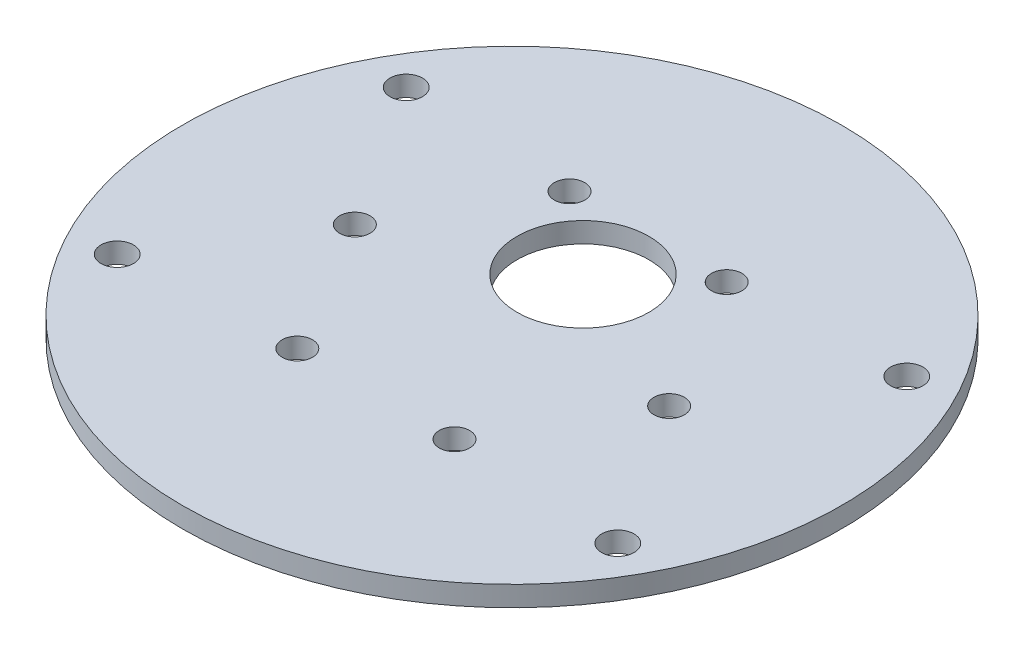
ISO-10303-21;
HEADER;
FILE_DESCRIPTION(('STEP AP214'),'2;1');
FILE_NAME('part.step','',(''),(''),'','','');
FILE_SCHEMA(('AUTOMOTIVE_DESIGN { 1 0 10303 214 1 1 1 1 }'));
ENDSEC;
DATA;
#1=APPLICATION_CONTEXT('core data for automotive mechanical design processes');
#2=APPLICATION_PROTOCOL_DEFINITION('international standard','automotive_design',2000,#1);
#3=PRODUCT_CONTEXT('',#1,'mechanical');
#4=PRODUCT('Part','Part','',(#3));
#5=PRODUCT_RELATED_PRODUCT_CATEGORY('part','',(#4));
#6=PRODUCT_DEFINITION_FORMATION('','',#4);
#7=PRODUCT_DEFINITION_CONTEXT('part definition',#1,'design');
#8=PRODUCT_DEFINITION('design','',#6,#7);
#9=PRODUCT_DEFINITION_SHAPE('','',#8);
#10=(LENGTH_UNIT() NAMED_UNIT(*) SI_UNIT(.MILLI.,.METRE.));
#11=(NAMED_UNIT(*) PLANE_ANGLE_UNIT() SI_UNIT($,.RADIAN.));
#12=(NAMED_UNIT(*) SI_UNIT($,.STERADIAN.) SOLID_ANGLE_UNIT());
#13=UNCERTAINTY_MEASURE_WITH_UNIT(LENGTH_MEASURE(1.E-05),#10,'distance_accuracy_value','');
#14=(GEOMETRIC_REPRESENTATION_CONTEXT(3) GLOBAL_UNCERTAINTY_ASSIGNED_CONTEXT((#13)) GLOBAL_UNIT_ASSIGNED_CONTEXT((#10,
#11,#12)) REPRESENTATION_CONTEXT('',''));
#15=CARTESIAN_POINT('',(0.,0.,0.));
#16=DIRECTION('',(0.,0.,1.));
#17=DIRECTION('',(1.,0.,0.));
#18=AXIS2_PLACEMENT_3D('',#15,#16,#17);
#19=CARTESIAN_POINT('',(0.,2.,0.));
#20=DIRECTION('',(0.,1.,0.));
#21=DIRECTION('',(0.,0.,1.));
#22=AXIS2_PLACEMENT_3D('',#19,#20,#21);
#23=PLANE('',#22);
#24=CARTESIAN_POINT('',(-7.75000000000001,2.,-13.4233937586588));
#25=DIRECTION('',(0.,1.,0.));
#26=DIRECTION('',(0.,0.,1.));
#27=AXIS2_PLACEMENT_3D('',#24,#25,#26);
#28=CIRCLE('',#27,1.5);
#29=CARTESIAN_POINT('',(-7.75000000000001,2.,-11.9233937586588));
#30=VERTEX_POINT('',#29);
#31=EDGE_CURVE('E99',#30,#30,#28,.T.);
#32=ORIENTED_EDGE('',*,*,#31,.F.);
#33=EDGE_LOOP('',(#32));
#34=FACE_BOUND('',#33,.T.);
#35=CARTESIAN_POINT('',(24.6817240078565,2.,-14.25));
#36=DIRECTION('',(0.,1.,0.));
#37=DIRECTION('',(0.,0.,-1.));
#38=AXIS2_PLACEMENT_3D('',#35,#36,#37);
#39=CIRCLE('',#38,1.6);
#40=CARTESIAN_POINT('',(24.6817240078565,2.,-15.85));
#41=VERTEX_POINT('',#40);
#42=EDGE_CURVE('E87',#41,#41,#39,.T.);
#43=ORIENTED_EDGE('',*,*,#42,.F.);
#44=EDGE_LOOP('',(#43));
#45=FACE_BOUND('',#44,.T.);
#46=CARTESIAN_POINT('',(-15.5,2.,0.));
#47=DIRECTION('',(0.,1.,0.));
#48=DIRECTION('',(0.,0.,1.));
#49=AXIS2_PLACEMENT_3D('',#46,#47,#48);
#50=CIRCLE('',#49,1.5);
#51=CARTESIAN_POINT('',(-15.5,2.,1.50000000000001));
#52=VERTEX_POINT('',#51);
#53=EDGE_CURVE('E75',#52,#52,#50,.T.);
#54=ORIENTED_EDGE('',*,*,#53,.F.);
#55=EDGE_LOOP('',(#54));
#56=FACE_BOUND('',#55,.T.);
#57=CARTESIAN_POINT('',(-7.75,2.,13.4233937586588));
#58=DIRECTION('',(0.,1.,0.));
#59=DIRECTION('',(0.,0.,1.));
#60=AXIS2_PLACEMENT_3D('',#57,#58,#59);
#61=CIRCLE('',#60,1.5);
#62=CARTESIAN_POINT('',(-7.75,2.,14.9233937586588));
#63=VERTEX_POINT('',#62);
#64=EDGE_CURVE('E63',#63,#63,#61,.T.);
#65=ORIENTED_EDGE('',*,*,#64,.F.);
#66=EDGE_LOOP('',(#65));
#67=FACE_BOUND('',#66,.T.);
#68=CARTESIAN_POINT('',(15.5,2.,0.));
#69=DIRECTION('',(0.,1.,0.));
#70=DIRECTION('',(0.,0.,1.));
#71=AXIS2_PLACEMENT_3D('',#68,#69,#70);
#72=CIRCLE('',#71,1.5);
#73=CARTESIAN_POINT('',(15.5,2.,1.5));
#74=VERTEX_POINT('',#73);
#75=EDGE_CURVE('E51',#74,#74,#72,.T.);
#76=ORIENTED_EDGE('',*,*,#75,.F.);
#77=EDGE_LOOP('',(#76));
#78=FACE_BOUND('',#77,.T.);
#79=CARTESIAN_POINT('',(0.,2.,0.));
#80=DIRECTION('',(0.,1.,0.));
#81=DIRECTION('',(0.,0.,1.));
#82=AXIS2_PLACEMENT_3D('',#79,#80,#81);
#83=CIRCLE('',#82,32.5);
#84=CARTESIAN_POINT('',(0.,2.,32.5));
#85=VERTEX_POINT('',#84);
#86=EDGE_CURVE('E10',#85,#85,#83,.T.);
#87=ORIENTED_EDGE('',*,*,#86,.T.);
#88=EDGE_LOOP('',(#87));
#89=FACE_BOUND('',#88,.T.);
#90=CARTESIAN_POINT('',(0.,2.,-7.));
#91=DIRECTION('',(0.,1.,0.));
#92=DIRECTION('',(0.,0.,1.));
#93=AXIS2_PLACEMENT_3D('',#90,#91,#92);
#94=CIRCLE('',#93,6.5);
#95=CARTESIAN_POINT('',(0.,2.,-0.499999999999999));
#96=VERTEX_POINT('',#95);
#97=EDGE_CURVE('E46',#96,#96,#94,.T.);
#98=ORIENTED_EDGE('',*,*,#97,.F.);
#99=EDGE_LOOP('',(#98));
#100=FACE_BOUND('',#99,.T.);
#101=CARTESIAN_POINT('',(7.75,2.,13.4233937586588));
#102=DIRECTION('',(0.,1.,0.));
#103=DIRECTION('',(0.,0.,1.));
#104=AXIS2_PLACEMENT_3D('',#101,#102,#103);
#105=CIRCLE('',#104,1.5);
#106=CARTESIAN_POINT('',(7.75,2.,14.9233937586588));
#107=VERTEX_POINT('',#106);
#108=EDGE_CURVE('E57',#107,#107,#105,.T.);
#109=ORIENTED_EDGE('',*,*,#108,.F.);
#110=EDGE_LOOP('',(#109));
#111=FACE_BOUND('',#110,.T.);
#112=CARTESIAN_POINT('',(24.6817240078565,2.,14.25));
#113=DIRECTION('',(0.,1.,0.));
#114=DIRECTION('',(0.,0.,1.));
#115=AXIS2_PLACEMENT_3D('',#112,#113,#114);
#116=CIRCLE('',#115,1.6);
#117=CARTESIAN_POINT('',(24.6817240078565,2.,15.85));
#118=VERTEX_POINT('',#117);
#119=EDGE_CURVE('E69',#118,#118,#116,.T.);
#120=ORIENTED_EDGE('',*,*,#119,.F.);
#121=EDGE_LOOP('',(#120));
#122=FACE_BOUND('',#121,.T.);
#123=CARTESIAN_POINT('',(-24.6817240078565,2.,14.25));
#124=DIRECTION('',(0.,1.,0.));
#125=DIRECTION('',(0.,0.,-1.));
#126=AXIS2_PLACEMENT_3D('',#123,#124,#125);
#127=CIRCLE('',#126,1.6);
#128=CARTESIAN_POINT('',(-24.6817240078565,2.,12.65));
#129=VERTEX_POINT('',#128);
#130=EDGE_CURVE('E81',#129,#129,#127,.T.);
#131=ORIENTED_EDGE('',*,*,#130,.F.);
#132=EDGE_LOOP('',(#131));
#133=FACE_BOUND('',#132,.T.);
#134=CARTESIAN_POINT('',(-24.6817240078565,2.,-14.25));
#135=DIRECTION('',(0.,1.,0.));
#136=DIRECTION('',(0.,0.,1.));
#137=AXIS2_PLACEMENT_3D('',#134,#135,#136);
#138=CIRCLE('',#137,1.6);
#139=CARTESIAN_POINT('',(-24.6817240078565,2.,-12.65));
#140=VERTEX_POINT('',#139);
#141=EDGE_CURVE('E93',#140,#140,#138,.T.);
#142=ORIENTED_EDGE('',*,*,#141,.F.);
#143=EDGE_LOOP('',(#142));
#144=FACE_BOUND('',#143,.T.);
#145=CARTESIAN_POINT('',(7.75,2.,-13.4233937586588));
#146=DIRECTION('',(0.,1.,0.));
#147=DIRECTION('',(0.,0.,1.));
#148=AXIS2_PLACEMENT_3D('',#145,#146,#147);
#149=CIRCLE('',#148,1.5);
#150=CARTESIAN_POINT('',(7.75,2.,-11.9233937586588));
#151=VERTEX_POINT('',#150);
#152=EDGE_CURVE('E105',#151,#151,#149,.T.);
#153=ORIENTED_EDGE('',*,*,#152,.F.);
#154=EDGE_LOOP('',(#153));
#155=FACE_BOUND('',#154,.T.);
#156=ADVANCED_FACE('F35',(#34,#45,#56,#67,#78,#89,#100,#111,#122,#133,#144,#155),#23,.T.);
#157=CARTESIAN_POINT('',(0.,0.,0.));
#158=DIRECTION('',(0.,1.,0.));
#159=DIRECTION('',(0.,0.,1.));
#160=AXIS2_PLACEMENT_3D('',#157,#158,#159);
#161=PLANE('',#160);
#162=CARTESIAN_POINT('',(0.,0.,0.));
#163=DIRECTION('',(0.,1.,0.));
#164=DIRECTION('',(0.,0.,1.));
#165=AXIS2_PLACEMENT_3D('',#162,#163,#164);
#166=CIRCLE('',#165,32.5);
#167=CARTESIAN_POINT('',(0.,0.,32.5));
#168=VERTEX_POINT('',#167);
#169=EDGE_CURVE('E39',#168,#168,#166,.T.);
#170=ORIENTED_EDGE('',*,*,#169,.F.);
#171=EDGE_LOOP('',(#170));
#172=FACE_BOUND('',#171,.T.);
#173=CARTESIAN_POINT('',(0.,0.,-7.));
#174=DIRECTION('',(0.,1.,0.));
#175=DIRECTION('',(0.,0.,1.));
#176=AXIS2_PLACEMENT_3D('',#173,#174,#175);
#177=CIRCLE('',#176,6.5);
#178=CARTESIAN_POINT('',(0.,0.,-0.499999999999999));
#179=VERTEX_POINT('',#178);
#180=EDGE_CURVE('E48',#179,#179,#177,.T.);
#181=ORIENTED_EDGE('',*,*,#180,.T.);
#182=EDGE_LOOP('',(#181));
#183=FACE_BOUND('',#182,.T.);
#184=CARTESIAN_POINT('',(15.5,0.,0.));
#185=DIRECTION('',(0.,1.,0.));
#186=DIRECTION('',(0.,0.,1.));
#187=AXIS2_PLACEMENT_3D('',#184,#185,#186);
#188=CIRCLE('',#187,1.5);
#189=CARTESIAN_POINT('',(15.5,0.,1.5));
#190=VERTEX_POINT('',#189);
#191=EDGE_CURVE('E54',#190,#190,#188,.T.);
#192=ORIENTED_EDGE('',*,*,#191,.T.);
#193=EDGE_LOOP('',(#192));
#194=FACE_BOUND('',#193,.T.);
#195=CARTESIAN_POINT('',(7.75,0.,13.4233937586588));
#196=DIRECTION('',(0.,1.,0.));
#197=DIRECTION('',(0.,0.,1.));
#198=AXIS2_PLACEMENT_3D('',#195,#196,#197);
#199=CIRCLE('',#198,1.5);
#200=CARTESIAN_POINT('',(7.75,0.,14.9233937586588));
#201=VERTEX_POINT('',#200);
#202=EDGE_CURVE('E60',#201,#201,#199,.T.);
#203=ORIENTED_EDGE('',*,*,#202,.T.);
#204=EDGE_LOOP('',(#203));
#205=FACE_BOUND('',#204,.T.);
#206=CARTESIAN_POINT('',(-7.75,0.,13.4233937586588));
#207=DIRECTION('',(0.,1.,0.));
#208=DIRECTION('',(0.,0.,1.));
#209=AXIS2_PLACEMENT_3D('',#206,#207,#208);
#210=CIRCLE('',#209,1.5);
#211=CARTESIAN_POINT('',(-7.75,0.,14.9233937586588));
#212=VERTEX_POINT('',#211);
#213=EDGE_CURVE('E66',#212,#212,#210,.T.);
#214=ORIENTED_EDGE('',*,*,#213,.T.);
#215=EDGE_LOOP('',(#214));
#216=FACE_BOUND('',#215,.T.);
#217=CARTESIAN_POINT('',(24.6817240078565,0.,14.25));
#218=DIRECTION('',(0.,1.,0.));
#219=DIRECTION('',(0.,0.,1.));
#220=AXIS2_PLACEMENT_3D('',#217,#218,#219);
#221=CIRCLE('',#220,1.6);
#222=CARTESIAN_POINT('',(24.6817240078565,0.,15.85));
#223=VERTEX_POINT('',#222);
#224=EDGE_CURVE('E72',#223,#223,#221,.T.);
#225=ORIENTED_EDGE('',*,*,#224,.T.);
#226=EDGE_LOOP('',(#225));
#227=FACE_BOUND('',#226,.T.);
#228=CARTESIAN_POINT('',(-15.5,0.,0.));
#229=DIRECTION('',(0.,1.,0.));
#230=DIRECTION('',(0.,0.,1.));
#231=AXIS2_PLACEMENT_3D('',#228,#229,#230);
#232=CIRCLE('',#231,1.5);
#233=CARTESIAN_POINT('',(-15.5,0.,1.50000000000001));
#234=VERTEX_POINT('',#233);
#235=EDGE_CURVE('E78',#234,#234,#232,.T.);
#236=ORIENTED_EDGE('',*,*,#235,.T.);
#237=EDGE_LOOP('',(#236));
#238=FACE_BOUND('',#237,.T.);
#239=CARTESIAN_POINT('',(-24.6817240078565,0.,14.25));
#240=DIRECTION('',(0.,1.,0.));
#241=DIRECTION('',(0.,0.,-1.));
#242=AXIS2_PLACEMENT_3D('',#239,#240,#241);
#243=CIRCLE('',#242,1.6);
#244=CARTESIAN_POINT('',(-24.6817240078565,0.,12.65));
#245=VERTEX_POINT('',#244);
#246=EDGE_CURVE('E84',#245,#245,#243,.T.);
#247=ORIENTED_EDGE('',*,*,#246,.T.);
#248=EDGE_LOOP('',(#247));
#249=FACE_BOUND('',#248,.T.);
#250=CARTESIAN_POINT('',(24.6817240078565,0.,-14.25));
#251=DIRECTION('',(0.,1.,0.));
#252=DIRECTION('',(0.,0.,-1.));
#253=AXIS2_PLACEMENT_3D('',#250,#251,#252);
#254=CIRCLE('',#253,1.6);
#255=CARTESIAN_POINT('',(24.6817240078565,0.,-15.85));
#256=VERTEX_POINT('',#255);
#257=EDGE_CURVE('E90',#256,#256,#254,.T.);
#258=ORIENTED_EDGE('',*,*,#257,.T.);
#259=EDGE_LOOP('',(#258));
#260=FACE_BOUND('',#259,.T.);
#261=CARTESIAN_POINT('',(-24.6817240078565,0.,-14.25));
#262=DIRECTION('',(0.,1.,0.));
#263=DIRECTION('',(0.,0.,1.));
#264=AXIS2_PLACEMENT_3D('',#261,#262,#263);
#265=CIRCLE('',#264,1.6);
#266=CARTESIAN_POINT('',(-24.6817240078565,0.,-12.65));
#267=VERTEX_POINT('',#266);
#268=EDGE_CURVE('E96',#267,#267,#265,.T.);
#269=ORIENTED_EDGE('',*,*,#268,.T.);
#270=EDGE_LOOP('',(#269));
#271=FACE_BOUND('',#270,.T.);
#272=CARTESIAN_POINT('',(-7.75000000000001,0.,-13.4233937586588));
#273=DIRECTION('',(0.,1.,0.));
#274=DIRECTION('',(0.,0.,1.));
#275=AXIS2_PLACEMENT_3D('',#272,#273,#274);
#276=CIRCLE('',#275,1.5);
#277=CARTESIAN_POINT('',(-7.75000000000001,0.,-11.9233937586588));
#278=VERTEX_POINT('',#277);
#279=EDGE_CURVE('E102',#278,#278,#276,.T.);
#280=ORIENTED_EDGE('',*,*,#279,.T.);
#281=EDGE_LOOP('',(#280));
#282=FACE_BOUND('',#281,.T.);
#283=CARTESIAN_POINT('',(7.75,0.,-13.4233937586588));
#284=DIRECTION('',(0.,1.,0.));
#285=DIRECTION('',(0.,0.,1.));
#286=AXIS2_PLACEMENT_3D('',#283,#284,#285);
#287=CIRCLE('',#286,1.5);
#288=CARTESIAN_POINT('',(7.75,0.,-11.9233937586588));
#289=VERTEX_POINT('',#288);
#290=EDGE_CURVE('E108',#289,#289,#287,.T.);
#291=ORIENTED_EDGE('',*,*,#290,.T.);
#292=EDGE_LOOP('',(#291));
#293=FACE_BOUND('',#292,.T.);
#294=ADVANCED_FACE('F118',(#172,#183,#194,#205,#216,#227,#238,#249,#260,#271,#282,#293),#161,.F.);
#295=CARTESIAN_POINT('',(0.,2.,0.));
#296=DIRECTION('',(0.,-1.,0.));
#297=DIRECTION('',(0.,0.,-1.));
#298=AXIS2_PLACEMENT_3D('',#295,#296,#297);
#299=CYLINDRICAL_SURFACE('',#298,32.5);
#300=ORIENTED_EDGE('',*,*,#86,.F.);
#301=EDGE_LOOP('',(#300));
#302=FACE_BOUND('',#301,.T.);
#303=ORIENTED_EDGE('',*,*,#169,.T.);
#304=EDGE_LOOP('',(#303));
#305=FACE_BOUND('',#304,.T.);
#306=ADVANCED_FACE('F37',(#302,#305),#299,.T.);
#307=CARTESIAN_POINT('',(0.,2.,-7.));
#308=DIRECTION('',(0.,-1.,0.));
#309=DIRECTION('',(0.,0.,-1.));
#310=AXIS2_PLACEMENT_3D('',#307,#308,#309);
#311=CYLINDRICAL_SURFACE('',#310,6.5);
#312=ORIENTED_EDGE('',*,*,#97,.T.);
#313=EDGE_LOOP('',(#312));
#314=FACE_BOUND('',#313,.T.);
#315=ORIENTED_EDGE('',*,*,#180,.F.);
#316=EDGE_LOOP('',(#315));
#317=FACE_BOUND('',#316,.T.);
#318=ADVANCED_FACE('F128',(#314,#317),#311,.F.);
#319=CARTESIAN_POINT('',(15.5,2.,0.));
#320=DIRECTION('',(0.,-1.,0.));
#321=DIRECTION('',(0.,0.,-1.));
#322=AXIS2_PLACEMENT_3D('',#319,#320,#321);
#323=CYLINDRICAL_SURFACE('',#322,1.5);
#324=ORIENTED_EDGE('',*,*,#75,.T.);
#325=EDGE_LOOP('',(#324));
#326=FACE_BOUND('',#325,.T.);
#327=ORIENTED_EDGE('',*,*,#191,.F.);
#328=EDGE_LOOP('',(#327));
#329=FACE_BOUND('',#328,.T.);
#330=ADVANCED_FACE('F131',(#326,#329),#323,.F.);
#331=CARTESIAN_POINT('',(7.75,2.,13.4233937586588));
#332=DIRECTION('',(0.,-1.,0.));
#333=DIRECTION('',(0.,0.,-1.));
#334=AXIS2_PLACEMENT_3D('',#331,#332,#333);
#335=CYLINDRICAL_SURFACE('',#334,1.5);
#336=ORIENTED_EDGE('',*,*,#108,.T.);
#337=EDGE_LOOP('',(#336));
#338=FACE_BOUND('',#337,.T.);
#339=ORIENTED_EDGE('',*,*,#202,.F.);
#340=EDGE_LOOP('',(#339));
#341=FACE_BOUND('',#340,.T.);
#342=ADVANCED_FACE('F135',(#338,#341),#335,.F.);
#343=CARTESIAN_POINT('',(-7.75,2.,13.4233937586588));
#344=DIRECTION('',(0.,-1.,0.));
#345=DIRECTION('',(0.,0.,-1.));
#346=AXIS2_PLACEMENT_3D('',#343,#344,#345);
#347=CYLINDRICAL_SURFACE('',#346,1.5);
#348=ORIENTED_EDGE('',*,*,#64,.T.);
#349=EDGE_LOOP('',(#348));
#350=FACE_BOUND('',#349,.T.);
#351=ORIENTED_EDGE('',*,*,#213,.F.);
#352=EDGE_LOOP('',(#351));
#353=FACE_BOUND('',#352,.T.);
#354=ADVANCED_FACE('F139',(#350,#353),#347,.F.);
#355=CARTESIAN_POINT('',(24.6817240078565,2.,14.25));
#356=DIRECTION('',(0.,-1.,0.));
#357=DIRECTION('',(0.,0.,-1.));
#358=AXIS2_PLACEMENT_3D('',#355,#356,#357);
#359=CYLINDRICAL_SURFACE('',#358,1.6);
#360=ORIENTED_EDGE('',*,*,#119,.T.);
#361=EDGE_LOOP('',(#360));
#362=FACE_BOUND('',#361,.T.);
#363=ORIENTED_EDGE('',*,*,#224,.F.);
#364=EDGE_LOOP('',(#363));
#365=FACE_BOUND('',#364,.T.);
#366=ADVANCED_FACE('F143',(#362,#365),#359,.F.);
#367=CARTESIAN_POINT('',(-15.5,2.,0.));
#368=DIRECTION('',(0.,-1.,0.));
#369=DIRECTION('',(0.,0.,-1.));
#370=AXIS2_PLACEMENT_3D('',#367,#368,#369);
#371=CYLINDRICAL_SURFACE('',#370,1.5);
#372=ORIENTED_EDGE('',*,*,#53,.T.);
#373=EDGE_LOOP('',(#372));
#374=FACE_BOUND('',#373,.T.);
#375=ORIENTED_EDGE('',*,*,#235,.F.);
#376=EDGE_LOOP('',(#375));
#377=FACE_BOUND('',#376,.T.);
#378=ADVANCED_FACE('F147',(#374,#377),#371,.F.);
#379=CARTESIAN_POINT('',(-24.6817240078565,2.,14.25));
#380=DIRECTION('',(0.,-1.,0.));
#381=DIRECTION('',(0.,0.,-1.));
#382=AXIS2_PLACEMENT_3D('',#379,#380,#381);
#383=CYLINDRICAL_SURFACE('',#382,1.6);
#384=ORIENTED_EDGE('',*,*,#130,.T.);
#385=EDGE_LOOP('',(#384));
#386=FACE_BOUND('',#385,.T.);
#387=ORIENTED_EDGE('',*,*,#246,.F.);
#388=EDGE_LOOP('',(#387));
#389=FACE_BOUND('',#388,.T.);
#390=ADVANCED_FACE('F151',(#386,#389),#383,.F.);
#391=CARTESIAN_POINT('',(24.6817240078565,2.,-14.25));
#392=DIRECTION('',(0.,-1.,0.));
#393=DIRECTION('',(0.,0.,-1.));
#394=AXIS2_PLACEMENT_3D('',#391,#392,#393);
#395=CYLINDRICAL_SURFACE('',#394,1.6);
#396=ORIENTED_EDGE('',*,*,#42,.T.);
#397=EDGE_LOOP('',(#396));
#398=FACE_BOUND('',#397,.T.);
#399=ORIENTED_EDGE('',*,*,#257,.F.);
#400=EDGE_LOOP('',(#399));
#401=FACE_BOUND('',#400,.T.);
#402=ADVANCED_FACE('F155',(#398,#401),#395,.F.);
#403=CARTESIAN_POINT('',(-24.6817240078565,2.,-14.25));
#404=DIRECTION('',(0.,-1.,0.));
#405=DIRECTION('',(0.,0.,-1.));
#406=AXIS2_PLACEMENT_3D('',#403,#404,#405);
#407=CYLINDRICAL_SURFACE('',#406,1.6);
#408=ORIENTED_EDGE('',*,*,#141,.T.);
#409=EDGE_LOOP('',(#408));
#410=FACE_BOUND('',#409,.T.);
#411=ORIENTED_EDGE('',*,*,#268,.F.);
#412=EDGE_LOOP('',(#411));
#413=FACE_BOUND('',#412,.T.);
#414=ADVANCED_FACE('F159',(#410,#413),#407,.F.);
#415=CARTESIAN_POINT('',(-7.75000000000001,2.,-13.4233937586588));
#416=DIRECTION('',(0.,-1.,0.));
#417=DIRECTION('',(0.,0.,-1.));
#418=AXIS2_PLACEMENT_3D('',#415,#416,#417);
#419=CYLINDRICAL_SURFACE('',#418,1.5);
#420=ORIENTED_EDGE('',*,*,#31,.T.);
#421=EDGE_LOOP('',(#420));
#422=FACE_BOUND('',#421,.T.);
#423=ORIENTED_EDGE('',*,*,#279,.F.);
#424=EDGE_LOOP('',(#423));
#425=FACE_BOUND('',#424,.T.);
#426=ADVANCED_FACE('F163',(#422,#425),#419,.F.);
#427=CARTESIAN_POINT('',(7.75,2.,-13.4233937586588));
#428=DIRECTION('',(0.,-1.,0.));
#429=DIRECTION('',(0.,0.,-1.));
#430=AXIS2_PLACEMENT_3D('',#427,#428,#429);
#431=CYLINDRICAL_SURFACE('',#430,1.5);
#432=ORIENTED_EDGE('',*,*,#152,.T.);
#433=EDGE_LOOP('',(#432));
#434=FACE_BOUND('',#433,.T.);
#435=ORIENTED_EDGE('',*,*,#290,.F.);
#436=EDGE_LOOP('',(#435));
#437=FACE_BOUND('',#436,.T.);
#438=ADVANCED_FACE('F114',(#434,#437),#431,.F.);
#439=CLOSED_SHELL('',(#156,#294,#306,#318,#330,#342,#354,#366,#378,#390,#402,#414,#426,#438));
#440=MANIFOLD_SOLID_BREP('B2',#439);
#441=ADVANCED_BREP_SHAPE_REPRESENTATION('',(#18,#440),#14);
#442=SHAPE_DEFINITION_REPRESENTATION(#9,#441);
ENDSEC;
END-ISO-10303-21;
